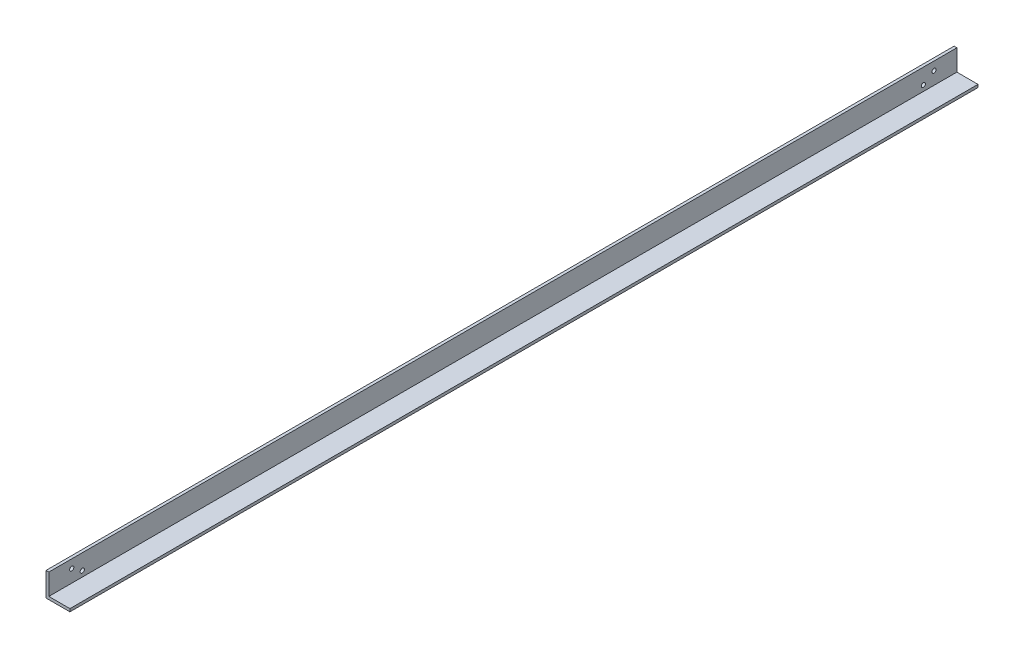
ISO-10303-21;
HEADER;
FILE_DESCRIPTION(('STEP AP214'),'2;1');
FILE_NAME('part.step','',(''),(''),'','','');
FILE_SCHEMA(('AUTOMOTIVE_DESIGN { 1 0 10303 214 1 1 1 1 }'));
ENDSEC;
DATA;
#1=APPLICATION_CONTEXT('core data for automotive mechanical design processes');
#2=APPLICATION_PROTOCOL_DEFINITION('international standard','automotive_design',2000,#1);
#3=PRODUCT_CONTEXT('',#1,'mechanical');
#4=PRODUCT('Part','Part','',(#3));
#5=PRODUCT_RELATED_PRODUCT_CATEGORY('part','',(#4));
#6=PRODUCT_DEFINITION_FORMATION('','',#4);
#7=PRODUCT_DEFINITION_CONTEXT('part definition',#1,'design');
#8=PRODUCT_DEFINITION('design','',#6,#7);
#9=PRODUCT_DEFINITION_SHAPE('','',#8);
#10=(LENGTH_UNIT() NAMED_UNIT(*) SI_UNIT(.MILLI.,.METRE.));
#11=(NAMED_UNIT(*) PLANE_ANGLE_UNIT() SI_UNIT($,.RADIAN.));
#12=(NAMED_UNIT(*) SI_UNIT($,.STERADIAN.) SOLID_ANGLE_UNIT());
#13=UNCERTAINTY_MEASURE_WITH_UNIT(LENGTH_MEASURE(1.E-05),#10,'distance_accuracy_value','');
#14=(GEOMETRIC_REPRESENTATION_CONTEXT(3) GLOBAL_UNCERTAINTY_ASSIGNED_CONTEXT((#13)) GLOBAL_UNIT_ASSIGNED_CONTEXT((#10,
#11,#12)) REPRESENTATION_CONTEXT('',''));
#15=CARTESIAN_POINT('',(0.,0.,0.));
#16=DIRECTION('',(0.,0.,1.));
#17=DIRECTION('',(1.,0.,0.));
#18=AXIS2_PLACEMENT_3D('',#15,#16,#17);
#19=CARTESIAN_POINT('',(13.,0.,-645.));
#20=DIRECTION('',(0.,1.,0.));
#21=DIRECTION('',(-1.,0.,0.));
#22=AXIS2_PLACEMENT_3D('',#19,#20,#21);
#23=PLANE('',#22);
#24=DIRECTION('',(-1.,0.,0.));
#25=VECTOR('',#24,1.);
#26=CARTESIAN_POINT('',(13.,0.,0.));
#27=LINE('',#26,#25);
#28=CARTESIAN_POINT('',(15.,0.,0.));
#29=VERTEX_POINT('',#28);
#30=CARTESIAN_POINT('',(0.,0.,0.));
#31=VERTEX_POINT('',#30);
#32=EDGE_CURVE('E148',#29,#31,#27,.T.);
#33=ORIENTED_EDGE('',*,*,#32,.F.);
#34=DIRECTION('',(0.,0.,-1.));
#35=VECTOR('',#34,1.);
#36=CARTESIAN_POINT('',(15.,0.,2.82842712474629));
#37=LINE('',#36,#35);
#38=CARTESIAN_POINT('',(15.,0.,-645.));
#39=VERTEX_POINT('',#38);
#40=EDGE_CURVE('E125',#29,#39,#37,.T.);
#41=ORIENTED_EDGE('',*,*,#40,.T.);
#42=DIRECTION('',(-1.,0.,0.));
#43=VECTOR('',#42,1.);
#44=CARTESIAN_POINT('',(13.,0.,-645.));
#45=LINE('',#44,#43);
#46=CARTESIAN_POINT('',(0.,0.,-645.));
#47=VERTEX_POINT('',#46);
#48=EDGE_CURVE('E144',#39,#47,#45,.T.);
#49=ORIENTED_EDGE('',*,*,#48,.T.);
#50=DIRECTION('',(0.,0.,1.));
#51=VECTOR('',#50,1.);
#52=CARTESIAN_POINT('',(0.,0.,-645.));
#53=LINE('',#52,#51);
#54=EDGE_CURVE('E44',#47,#31,#53,.T.);
#55=ORIENTED_EDGE('',*,*,#54,.T.);
#56=EDGE_LOOP('',(#33,#41,#49,#55));
#57=FACE_BOUND('',#56,.T.);
#58=ADVANCED_FACE('F35',(#57),#23,.T.);
#59=CARTESIAN_POINT('',(-2.,-2.,-645.));
#60=DIRECTION('',(0.,-1.,0.));
#61=DIRECTION('',(1.,0.,0.));
#62=AXIS2_PLACEMENT_3D('',#59,#60,#61);
#63=PLANE('',#62);
#64=DIRECTION('',(1.,0.,0.));
#65=VECTOR('',#64,1.);
#66=CARTESIAN_POINT('',(-2.,-2.,0.));
#67=LINE('',#66,#65);
#68=CARTESIAN_POINT('',(-2.,-2.,0.));
#69=VERTEX_POINT('',#68);
#70=CARTESIAN_POINT('',(15.,-2.,0.));
#71=VERTEX_POINT('',#70);
#72=EDGE_CURVE('E68',#69,#71,#67,.T.);
#73=ORIENTED_EDGE('',*,*,#72,.F.);
#74=DIRECTION('',(0.,0.,1.));
#75=VECTOR('',#74,1.);
#76=CARTESIAN_POINT('',(-2.,-2.,-645.));
#77=LINE('',#76,#75);
#78=CARTESIAN_POINT('',(-2.,-2.,-645.));
#79=VERTEX_POINT('',#78);
#80=EDGE_CURVE('E11',#79,#69,#77,.T.);
#81=ORIENTED_EDGE('',*,*,#80,.F.);
#82=DIRECTION('',(1.,0.,0.));
#83=VECTOR('',#82,1.);
#84=CARTESIAN_POINT('',(-2.,-2.,-645.));
#85=LINE('',#84,#83);
#86=CARTESIAN_POINT('',(15.,-2.,-645.));
#87=VERTEX_POINT('',#86);
#88=EDGE_CURVE('E98',#79,#87,#85,.T.);
#89=ORIENTED_EDGE('',*,*,#88,.T.);
#90=DIRECTION('',(0.,0.,-1.));
#91=VECTOR('',#90,1.);
#92=CARTESIAN_POINT('',(15.,-2.,2.82842712474629));
#93=LINE('',#92,#91);
#94=EDGE_CURVE('E122',#71,#87,#93,.T.);
#95=ORIENTED_EDGE('',*,*,#94,.F.);
#96=EDGE_LOOP('',(#73,#81,#89,#95));
#97=FACE_BOUND('',#96,.T.);
#98=ADVANCED_FACE('F175',(#97),#63,.T.);
#99=CARTESIAN_POINT('',(-2.,13.,-645.));
#100=DIRECTION('',(-1.,0.,0.));
#101=DIRECTION('',(0.,-1.,0.));
#102=AXIS2_PLACEMENT_3D('',#99,#100,#101);
#103=PLANE('',#102);
#104=CARTESIAN_POINT('',(-2.,8.99999999999993,-628.71));
#105=DIRECTION('',(-1.,0.,0.));
#106=DIRECTION('',(0.,-1.,0.));
#107=AXIS2_PLACEMENT_3D('',#104,#105,#106);
#108=CIRCLE('',#107,1.50000000000008);
#109=CARTESIAN_POINT('',(-2.,7.49999999999984,-628.71));
#110=VERTEX_POINT('',#109);
#111=EDGE_CURVE('E121',#110,#110,#108,.F.);
#112=ORIENTED_EDGE('',*,*,#111,.T.);
#113=EDGE_LOOP('',(#112));
#114=FACE_BOUND('',#113,.T.);
#115=CARTESIAN_POINT('',(-2.,4.00000000000001,-621.21));
#116=DIRECTION('',(-1.,0.,0.));
#117=DIRECTION('',(0.,-1.,0.));
#118=AXIS2_PLACEMENT_3D('',#115,#116,#117);
#119=CIRCLE('',#118,1.49999999999997);
#120=CARTESIAN_POINT('',(-2.,2.50000000000004,-621.21));
#121=VERTEX_POINT('',#120);
#122=EDGE_CURVE('E132',#121,#121,#119,.F.);
#123=ORIENTED_EDGE('',*,*,#122,.T.);
#124=EDGE_LOOP('',(#123));
#125=FACE_BOUND('',#124,.T.);
#126=CARTESIAN_POINT('',(-2.,4.,-23.79));
#127=DIRECTION('',(-1.,0.,0.));
#128=DIRECTION('',(0.,-1.,0.));
#129=AXIS2_PLACEMENT_3D('',#126,#127,#128);
#130=CIRCLE('',#129,1.5);
#131=CARTESIAN_POINT('',(-2.,2.5,-23.79));
#132=VERTEX_POINT('',#131);
#133=EDGE_CURVE('E136',#132,#132,#130,.T.);
#134=ORIENTED_EDGE('',*,*,#133,.F.);
#135=EDGE_LOOP('',(#134));
#136=FACE_BOUND('',#135,.T.);
#137=CARTESIAN_POINT('',(-2.,9.,-16.29));
#138=DIRECTION('',(-1.,0.,0.));
#139=DIRECTION('',(0.,-1.,0.));
#140=AXIS2_PLACEMENT_3D('',#137,#138,#139);
#141=CIRCLE('',#140,1.5);
#142=CARTESIAN_POINT('',(-2.,7.5,-16.29));
#143=VERTEX_POINT('',#142);
#144=EDGE_CURVE('E140',#143,#143,#141,.T.);
#145=ORIENTED_EDGE('',*,*,#144,.F.);
#146=EDGE_LOOP('',(#145));
#147=FACE_BOUND('',#146,.T.);
#148=DIRECTION('',(0.,-1.,0.));
#149=VECTOR('',#148,1.);
#150=CARTESIAN_POINT('',(-2.,13.,0.));
#151=LINE('',#150,#149);
#152=CARTESIAN_POINT('',(-2.,15.,0.));
#153=VERTEX_POINT('',#152);
#154=EDGE_CURVE('E105',#153,#69,#151,.T.);
#155=ORIENTED_EDGE('',*,*,#154,.F.);
#156=DIRECTION('',(0.,0.,-1.));
#157=VECTOR('',#156,1.);
#158=CARTESIAN_POINT('',(-2.,15.,2.82842712474629));
#159=LINE('',#158,#157);
#160=CARTESIAN_POINT('',(-2.,15.,-645.));
#161=VERTEX_POINT('',#160);
#162=EDGE_CURVE('E103',#153,#161,#159,.T.);
#163=ORIENTED_EDGE('',*,*,#162,.T.);
#164=DIRECTION('',(0.,-1.,0.));
#165=VECTOR('',#164,1.);
#166=CARTESIAN_POINT('',(-2.,13.,-645.));
#167=LINE('',#166,#165);
#168=EDGE_CURVE('E91',#161,#79,#167,.T.);
#169=ORIENTED_EDGE('',*,*,#168,.T.);
#170=ORIENTED_EDGE('',*,*,#80,.T.);
#171=EDGE_LOOP('',(#155,#163,#169,#170));
#172=FACE_BOUND('',#171,.T.);
#173=ADVANCED_FACE('F104',(#114,#125,#136,#147,#172),#103,.T.);
#174=CARTESIAN_POINT('',(0.,0.,-645.));
#175=DIRECTION('',(1.,0.,0.));
#176=DIRECTION('',(0.,1.,0.));
#177=AXIS2_PLACEMENT_3D('',#174,#175,#176);
#178=PLANE('',#177);
#179=CARTESIAN_POINT('',(0.,8.99999999999993,-628.71));
#180=DIRECTION('',(1.,0.,0.));
#181=DIRECTION('',(0.,1.,0.));
#182=AXIS2_PLACEMENT_3D('',#179,#180,#181);
#183=CIRCLE('',#182,1.50000000000008);
#184=CARTESIAN_POINT('',(0.,10.5,-628.71));
#185=VERTEX_POINT('',#184);
#186=EDGE_CURVE('E38',#185,#185,#183,.F.);
#187=ORIENTED_EDGE('',*,*,#186,.T.);
#188=EDGE_LOOP('',(#187));
#189=FACE_BOUND('',#188,.T.);
#190=CARTESIAN_POINT('',(0.,4.00000000000001,-621.21));
#191=DIRECTION('',(1.,0.,0.));
#192=DIRECTION('',(0.,1.,0.));
#193=AXIS2_PLACEMENT_3D('',#190,#191,#192);
#194=CIRCLE('',#193,1.49999999999997);
#195=CARTESIAN_POINT('',(0.,5.49999999999998,-621.21));
#196=VERTEX_POINT('',#195);
#197=EDGE_CURVE('E135',#196,#196,#194,.F.);
#198=ORIENTED_EDGE('',*,*,#197,.T.);
#199=EDGE_LOOP('',(#198));
#200=FACE_BOUND('',#199,.T.);
#201=CARTESIAN_POINT('',(0.,4.,-23.79));
#202=DIRECTION('',(1.,0.,0.));
#203=DIRECTION('',(0.,1.,0.));
#204=AXIS2_PLACEMENT_3D('',#201,#202,#203);
#205=CIRCLE('',#204,1.5);
#206=CARTESIAN_POINT('',(0.,5.5,-23.79));
#207=VERTEX_POINT('',#206);
#208=EDGE_CURVE('E139',#207,#207,#205,.T.);
#209=ORIENTED_EDGE('',*,*,#208,.F.);
#210=EDGE_LOOP('',(#209));
#211=FACE_BOUND('',#210,.T.);
#212=CARTESIAN_POINT('',(0.,9.,-16.29));
#213=DIRECTION('',(1.,0.,0.));
#214=DIRECTION('',(0.,1.,0.));
#215=AXIS2_PLACEMENT_3D('',#212,#213,#214);
#216=CIRCLE('',#215,1.5);
#217=CARTESIAN_POINT('',(0.,10.5,-16.29));
#218=VERTEX_POINT('',#217);
#219=EDGE_CURVE('E143',#218,#218,#216,.T.);
#220=ORIENTED_EDGE('',*,*,#219,.F.);
#221=EDGE_LOOP('',(#220));
#222=FACE_BOUND('',#221,.T.);
#223=DIRECTION('',(0.,1.,0.));
#224=VECTOR('',#223,1.);
#225=CARTESIAN_POINT('',(0.,0.,0.));
#226=LINE('',#225,#224);
#227=CARTESIAN_POINT('',(0.,15.,0.));
#228=VERTEX_POINT('',#227);
#229=EDGE_CURVE('E151',#31,#228,#226,.T.);
#230=ORIENTED_EDGE('',*,*,#229,.F.);
#231=ORIENTED_EDGE('',*,*,#54,.F.);
#232=DIRECTION('',(0.,1.,0.));
#233=VECTOR('',#232,1.);
#234=CARTESIAN_POINT('',(0.,0.,-645.));
#235=LINE('',#234,#233);
#236=CARTESIAN_POINT('',(0.,15.,-645.));
#237=VERTEX_POINT('',#236);
#238=EDGE_CURVE('E100',#47,#237,#235,.T.);
#239=ORIENTED_EDGE('',*,*,#238,.T.);
#240=DIRECTION('',(0.,0.,-1.));
#241=VECTOR('',#240,1.);
#242=CARTESIAN_POINT('',(0.,15.,2.82842712474629));
#243=LINE('',#242,#241);
#244=EDGE_CURVE('E109',#228,#237,#243,.T.);
#245=ORIENTED_EDGE('',*,*,#244,.F.);
#246=EDGE_LOOP('',(#230,#231,#239,#245));
#247=FACE_BOUND('',#246,.T.);
#248=ADVANCED_FACE('F162',(#189,#200,#211,#222,#247),#178,.T.);
#249=CARTESIAN_POINT('',(0.,0.,-645.));
#250=DIRECTION('',(0.,0.,-1.));
#251=DIRECTION('',(-1.,0.,0.));
#252=AXIS2_PLACEMENT_3D('',#249,#250,#251);
#253=PLANE('',#252);
#254=ORIENTED_EDGE('',*,*,#48,.F.);
#255=DIRECTION('',(0.,-1.,0.));
#256=VECTOR('',#255,1.);
#257=CARTESIAN_POINT('',(15.,-2.,-645.));
#258=LINE('',#257,#256);
#259=EDGE_CURVE('E123',#39,#87,#258,.T.);
#260=ORIENTED_EDGE('',*,*,#259,.T.);
#261=ORIENTED_EDGE('',*,*,#88,.F.);
#262=ORIENTED_EDGE('',*,*,#168,.F.);
#263=DIRECTION('',(1.,0.,0.));
#264=VECTOR('',#263,1.);
#265=CARTESIAN_POINT('',(0.,15.,-645.));
#266=LINE('',#265,#264);
#267=EDGE_CURVE('E96',#161,#237,#266,.T.);
#268=ORIENTED_EDGE('',*,*,#267,.T.);
#269=ORIENTED_EDGE('',*,*,#238,.F.);
#270=EDGE_LOOP('',(#254,#260,#261,#262,#268,#269));
#271=FACE_BOUND('',#270,.T.);
#272=ADVANCED_FACE('F93',(#271),#253,.T.);
#273=CARTESIAN_POINT('',(0.,0.,0.));
#274=DIRECTION('',(0.,0.,-1.));
#275=DIRECTION('',(-1.,0.,0.));
#276=AXIS2_PLACEMENT_3D('',#273,#274,#275);
#277=PLANE('',#276);
#278=ORIENTED_EDGE('',*,*,#32,.T.);
#279=ORIENTED_EDGE('',*,*,#229,.T.);
#280=DIRECTION('',(-1.,0.,0.));
#281=VECTOR('',#280,1.);
#282=CARTESIAN_POINT('',(0.,15.,0.));
#283=LINE('',#282,#281);
#284=EDGE_CURVE('E117',#228,#153,#283,.T.);
#285=ORIENTED_EDGE('',*,*,#284,.T.);
#286=ORIENTED_EDGE('',*,*,#154,.T.);
#287=ORIENTED_EDGE('',*,*,#72,.T.);
#288=DIRECTION('',(0.,1.,0.));
#289=VECTOR('',#288,1.);
#290=CARTESIAN_POINT('',(15.,-2.,0.));
#291=LINE('',#290,#289);
#292=EDGE_CURVE('E119',#71,#29,#291,.T.);
#293=ORIENTED_EDGE('',*,*,#292,.T.);
#294=EDGE_LOOP('',(#278,#279,#285,#286,#287,#293));
#295=FACE_BOUND('',#294,.T.);
#296=ADVANCED_FACE('F184',(#295),#277,.F.);
#297=CARTESIAN_POINT('',(13.,9.,-16.29));
#298=DIRECTION('',(-1.,0.,0.));
#299=DIRECTION('',(0.,-1.,0.));
#300=AXIS2_PLACEMENT_3D('',#297,#298,#299);
#301=CYLINDRICAL_SURFACE('',#300,1.5);
#302=ORIENTED_EDGE('',*,*,#219,.T.);
#303=EDGE_LOOP('',(#302));
#304=FACE_BOUND('',#303,.T.);
#305=ORIENTED_EDGE('',*,*,#144,.T.);
#306=EDGE_LOOP('',(#305));
#307=FACE_BOUND('',#306,.T.);
#308=ADVANCED_FACE('F182',(#304,#307),#301,.F.);
#309=CARTESIAN_POINT('',(13.,4.,-23.79));
#310=DIRECTION('',(-1.,0.,0.));
#311=DIRECTION('',(0.,-1.,0.));
#312=AXIS2_PLACEMENT_3D('',#309,#310,#311);
#313=CYLINDRICAL_SURFACE('',#312,1.5);
#314=ORIENTED_EDGE('',*,*,#208,.T.);
#315=EDGE_LOOP('',(#314));
#316=FACE_BOUND('',#315,.T.);
#317=ORIENTED_EDGE('',*,*,#133,.T.);
#318=EDGE_LOOP('',(#317));
#319=FACE_BOUND('',#318,.T.);
#320=ADVANCED_FACE('F169',(#316,#319),#313,.F.);
#321=CARTESIAN_POINT('',(13.,4.,-621.21));
#322=DIRECTION('',(-1.,0.,0.));
#323=DIRECTION('',(0.,-1.,0.));
#324=AXIS2_PLACEMENT_3D('',#321,#322,#323);
#325=CYLINDRICAL_SURFACE('',#324,1.49999999999997);
#326=ORIENTED_EDGE('',*,*,#197,.F.);
#327=EDGE_LOOP('',(#326));
#328=FACE_BOUND('',#327,.T.);
#329=ORIENTED_EDGE('',*,*,#122,.F.);
#330=EDGE_LOOP('',(#329));
#331=FACE_BOUND('',#330,.T.);
#332=ADVANCED_FACE('F165',(#328,#331),#325,.F.);
#333=CARTESIAN_POINT('',(13.,8.99999999999992,-628.71));
#334=DIRECTION('',(-1.,0.,0.));
#335=DIRECTION('',(0.,-1.,0.));
#336=AXIS2_PLACEMENT_3D('',#333,#334,#335);
#337=CYLINDRICAL_SURFACE('',#336,1.50000000000008);
#338=ORIENTED_EDGE('',*,*,#186,.F.);
#339=EDGE_LOOP('',(#338));
#340=FACE_BOUND('',#339,.T.);
#341=ORIENTED_EDGE('',*,*,#111,.F.);
#342=EDGE_LOOP('',(#341));
#343=FACE_BOUND('',#342,.T.);
#344=ADVANCED_FACE('F168',(#340,#343),#337,.F.);
#345=CARTESIAN_POINT('',(15.,-2.,2.82842712474629));
#346=DIRECTION('',(1.,0.,0.));
#347=DIRECTION('',(0.,0.,-1.));
#348=AXIS2_PLACEMENT_3D('',#345,#346,#347);
#349=PLANE('',#348);
#350=ORIENTED_EDGE('',*,*,#292,.F.);
#351=ORIENTED_EDGE('',*,*,#94,.T.);
#352=ORIENTED_EDGE('',*,*,#259,.F.);
#353=ORIENTED_EDGE('',*,*,#40,.F.);
#354=EDGE_LOOP('',(#350,#351,#352,#353));
#355=FACE_BOUND('',#354,.T.);
#356=ADVANCED_FACE('F205',(#355),#349,.T.);
#357=CARTESIAN_POINT('',(0.,15.,2.82842712474629));
#358=DIRECTION('',(0.,1.,0.));
#359=DIRECTION('',(0.,0.,1.));
#360=AXIS2_PLACEMENT_3D('',#357,#358,#359);
#361=PLANE('',#360);
#362=ORIENTED_EDGE('',*,*,#284,.F.);
#363=ORIENTED_EDGE('',*,*,#244,.T.);
#364=ORIENTED_EDGE('',*,*,#267,.F.);
#365=ORIENTED_EDGE('',*,*,#162,.F.);
#366=EDGE_LOOP('',(#362,#363,#364,#365));
#367=FACE_BOUND('',#366,.T.);
#368=ADVANCED_FACE('F112',(#367),#361,.T.);
#369=CLOSED_SHELL('',(#58,#98,#173,#248,#272,#296,#308,#320,#332,#344,#356,#368));
#370=MANIFOLD_SOLID_BREP('B2',#369);
#371=ADVANCED_BREP_SHAPE_REPRESENTATION('',(#18,#370),#14);
#372=SHAPE_DEFINITION_REPRESENTATION(#9,#371);
ENDSEC;
END-ISO-10303-21;
